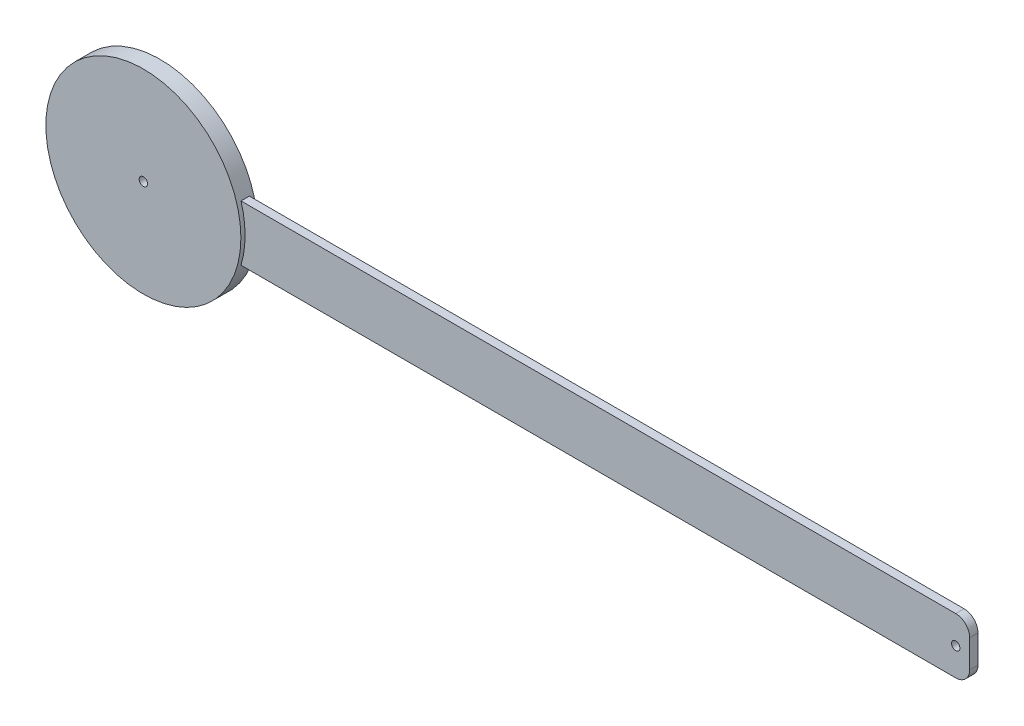
ISO-10303-21;
HEADER;
FILE_DESCRIPTION(('STEP AP214'),'2;1');
FILE_NAME('part.step','',(''),(''),'','','');
FILE_SCHEMA(('AUTOMOTIVE_DESIGN { 1 0 10303 214 1 1 1 1 }'));
ENDSEC;
DATA;
#1=APPLICATION_CONTEXT('core data for automotive mechanical design processes');
#2=APPLICATION_PROTOCOL_DEFINITION('international standard','automotive_design',2000,#1);
#3=PRODUCT_CONTEXT('',#1,'mechanical');
#4=PRODUCT('Part','Part','',(#3));
#5=PRODUCT_RELATED_PRODUCT_CATEGORY('part','',(#4));
#6=PRODUCT_DEFINITION_FORMATION('','',#4);
#7=PRODUCT_DEFINITION_CONTEXT('part definition',#1,'design');
#8=PRODUCT_DEFINITION('design','',#6,#7);
#9=PRODUCT_DEFINITION_SHAPE('','',#8);
#10=(LENGTH_UNIT() NAMED_UNIT(*) SI_UNIT(.MILLI.,.METRE.));
#11=(NAMED_UNIT(*) PLANE_ANGLE_UNIT() SI_UNIT($,.RADIAN.));
#12=(NAMED_UNIT(*) SI_UNIT($,.STERADIAN.) SOLID_ANGLE_UNIT());
#13=UNCERTAINTY_MEASURE_WITH_UNIT(LENGTH_MEASURE(1.E-05),#10,'distance_accuracy_value','');
#14=(GEOMETRIC_REPRESENTATION_CONTEXT(3) GLOBAL_UNCERTAINTY_ASSIGNED_CONTEXT((#13)) GLOBAL_UNIT_ASSIGNED_CONTEXT((#10,
#11,#12)) REPRESENTATION_CONTEXT('',''));
#15=CARTESIAN_POINT('',(0.,0.,0.));
#16=DIRECTION('',(0.,0.,1.));
#17=DIRECTION('',(1.,0.,0.));
#18=AXIS2_PLACEMENT_3D('',#15,#16,#17);
#19=CARTESIAN_POINT('',(145.,5.,3.));
#20=DIRECTION('',(0.,0.,-1.));
#21=DIRECTION('',(-1.,0.,0.));
#22=AXIS2_PLACEMENT_3D('',#19,#20,#21);
#23=PLANE('',#22);
#24=DIRECTION('',(-1.,0.,0.));
#25=VECTOR('',#24,1.);
#26=CARTESIAN_POINT('',(-145.,10.,3.));
#27=LINE('',#26,#25);
#28=CARTESIAN_POINT('',(145.,10.,3.));
#29=VERTEX_POINT('',#28);
#30=CARTESIAN_POINT('',(-111.458980337503,10.,3.));
#31=VERTEX_POINT('',#30);
#32=EDGE_CURVE('E85',#29,#31,#27,.T.);
#33=ORIENTED_EDGE('',*,*,#32,.T.);
#34=CARTESIAN_POINT('',(-145.,0.,3.));
#35=DIRECTION('',(0.,0.,-1.));
#36=DIRECTION('',(-1.,0.,0.));
#37=AXIS2_PLACEMENT_3D('',#34,#35,#36);
#38=CIRCLE('',#37,35.);
#39=CARTESIAN_POINT('',(-111.458980337503,-10.,3.));
#40=VERTEX_POINT('',#39);
#41=EDGE_CURVE('E95',#31,#40,#38,.T.);
#42=ORIENTED_EDGE('',*,*,#41,.T.);
#43=DIRECTION('',(1.,0.,0.));
#44=VECTOR('',#43,1.);
#45=CARTESIAN_POINT('',(-145.,-10.,3.));
#46=LINE('',#45,#44);
#47=CARTESIAN_POINT('',(145.,-10.,3.));
#48=VERTEX_POINT('',#47);
#49=EDGE_CURVE('E100',#40,#48,#46,.T.);
#50=ORIENTED_EDGE('',*,*,#49,.T.);
#51=CARTESIAN_POINT('',(145.,-5.,3.));
#52=DIRECTION('',(0.,0.,1.));
#53=DIRECTION('',(1.,0.,0.));
#54=AXIS2_PLACEMENT_3D('',#51,#52,#53);
#55=CIRCLE('',#54,5.);
#56=CARTESIAN_POINT('',(150.,-5.,3.));
#57=VERTEX_POINT('',#56);
#58=EDGE_CURVE('E108',#48,#57,#55,.T.);
#59=ORIENTED_EDGE('',*,*,#58,.T.);
#60=DIRECTION('',(0.,1.,0.));
#61=VECTOR('',#60,1.);
#62=CARTESIAN_POINT('',(150.,4.99999999999996,3.));
#63=LINE('',#62,#61);
#64=CARTESIAN_POINT('',(150.,4.99999999999996,3.));
#65=VERTEX_POINT('',#64);
#66=EDGE_CURVE('E56',#57,#65,#63,.T.);
#67=ORIENTED_EDGE('',*,*,#66,.T.);
#68=CARTESIAN_POINT('',(145.,5.,3.));
#69=DIRECTION('',(0.,0.,1.));
#70=DIRECTION('',(-1.,0.,0.));
#71=AXIS2_PLACEMENT_3D('',#68,#69,#70);
#72=CIRCLE('',#71,5.);
#73=EDGE_CURVE('E111',#65,#29,#72,.T.);
#74=ORIENTED_EDGE('',*,*,#73,.T.);
#75=EDGE_LOOP('',(#33,#42,#50,#59,#67,#74));
#76=FACE_BOUND('',#75,.T.);
#77=CARTESIAN_POINT('',(145.,0.,3.));
#78=DIRECTION('',(0.,0.,1.));
#79=DIRECTION('',(1.,0.,0.));
#80=AXIS2_PLACEMENT_3D('',#77,#78,#79);
#81=CIRCLE('',#80,1.5);
#82=CARTESIAN_POINT('',(146.5,0.,3.));
#83=VERTEX_POINT('',#82);
#84=EDGE_CURVE('E121',#83,#83,#81,.T.);
#85=ORIENTED_EDGE('',*,*,#84,.F.);
#86=EDGE_LOOP('',(#85));
#87=FACE_BOUND('',#86,.T.);
#88=ADVANCED_FACE('F33',(#76,#87),#23,.F.);
#89=CARTESIAN_POINT('',(145.,5.,0.));
#90=DIRECTION('',(0.,0.,-1.));
#91=DIRECTION('',(-1.,0.,0.));
#92=AXIS2_PLACEMENT_3D('',#89,#90,#91);
#93=PLANE('',#92);
#94=CARTESIAN_POINT('',(-145.,0.,0.));
#95=DIRECTION('',(0.,0.,-1.));
#96=DIRECTION('',(-1.,0.,0.));
#97=AXIS2_PLACEMENT_3D('',#94,#95,#96);
#98=CIRCLE('',#97,35.);
#99=CARTESIAN_POINT('',(-111.458980337503,10.,0.));
#100=VERTEX_POINT('',#99);
#101=CARTESIAN_POINT('',(-111.458980337503,-10.,0.));
#102=VERTEX_POINT('',#101);
#103=EDGE_CURVE('E48',#100,#102,#98,.T.);
#104=ORIENTED_EDGE('',*,*,#103,.F.);
#105=DIRECTION('',(-1.,0.,0.));
#106=VECTOR('',#105,1.);
#107=CARTESIAN_POINT('',(-145.,10.,0.));
#108=LINE('',#107,#106);
#109=CARTESIAN_POINT('',(145.,10.,0.));
#110=VERTEX_POINT('',#109);
#111=EDGE_CURVE('E120',#110,#100,#108,.T.);
#112=ORIENTED_EDGE('',*,*,#111,.F.);
#113=CARTESIAN_POINT('',(145.,5.,0.));
#114=DIRECTION('',(0.,0.,1.));
#115=DIRECTION('',(-1.,0.,0.));
#116=AXIS2_PLACEMENT_3D('',#113,#114,#115);
#117=CIRCLE('',#116,5.);
#118=CARTESIAN_POINT('',(150.,4.99999999999996,0.));
#119=VERTEX_POINT('',#118);
#120=EDGE_CURVE('E117',#119,#110,#117,.T.);
#121=ORIENTED_EDGE('',*,*,#120,.F.);
#122=DIRECTION('',(0.,1.,0.));
#123=VECTOR('',#122,1.);
#124=CARTESIAN_POINT('',(150.,4.99999999999996,0.));
#125=LINE('',#124,#123);
#126=CARTESIAN_POINT('',(150.,-5.,0.));
#127=VERTEX_POINT('',#126);
#128=EDGE_CURVE('E77',#127,#119,#125,.T.);
#129=ORIENTED_EDGE('',*,*,#128,.F.);
#130=CARTESIAN_POINT('',(145.,-5.,0.));
#131=DIRECTION('',(0.,0.,1.));
#132=DIRECTION('',(1.,0.,0.));
#133=AXIS2_PLACEMENT_3D('',#130,#131,#132);
#134=CIRCLE('',#133,5.);
#135=CARTESIAN_POINT('',(145.,-10.,0.));
#136=VERTEX_POINT('',#135);
#137=EDGE_CURVE('E126',#136,#127,#134,.T.);
#138=ORIENTED_EDGE('',*,*,#137,.F.);
#139=DIRECTION('',(1.,0.,0.));
#140=VECTOR('',#139,1.);
#141=CARTESIAN_POINT('',(-145.,-10.,0.));
#142=LINE('',#141,#140);
#143=EDGE_CURVE('E124',#102,#136,#142,.T.);
#144=ORIENTED_EDGE('',*,*,#143,.F.);
#145=EDGE_LOOP('',(#104,#112,#121,#129,#138,#144));
#146=FACE_BOUND('',#145,.T.);
#147=CARTESIAN_POINT('',(145.,0.,0.));
#148=DIRECTION('',(0.,0.,1.));
#149=DIRECTION('',(1.,0.,0.));
#150=AXIS2_PLACEMENT_3D('',#147,#148,#149);
#151=CIRCLE('',#150,1.5);
#152=CARTESIAN_POINT('',(146.5,0.,0.));
#153=VERTEX_POINT('',#152);
#154=EDGE_CURVE('E149',#153,#153,#151,.T.);
#155=ORIENTED_EDGE('',*,*,#154,.T.);
#156=EDGE_LOOP('',(#155));
#157=FACE_BOUND('',#156,.T.);
#158=ADVANCED_FACE('F138',(#146,#157),#93,.T.);
#159=CARTESIAN_POINT('',(145.,5.,3.));
#160=DIRECTION('',(0.,0.,-1.));
#161=DIRECTION('',(-1.,0.,0.));
#162=AXIS2_PLACEMENT_3D('',#159,#160,#161);
#163=CYLINDRICAL_SURFACE('',#162,5.);
#164=ORIENTED_EDGE('',*,*,#120,.T.);
#165=DIRECTION('',(0.,0.,-1.));
#166=VECTOR('',#165,1.);
#167=CARTESIAN_POINT('',(145.,10.,3.));
#168=LINE('',#167,#166);
#169=EDGE_CURVE('E41',#29,#110,#168,.T.);
#170=ORIENTED_EDGE('',*,*,#169,.F.);
#171=ORIENTED_EDGE('',*,*,#73,.F.);
#172=DIRECTION('',(0.,0.,-1.));
#173=VECTOR('',#172,1.);
#174=CARTESIAN_POINT('',(150.,4.99999999999996,3.));
#175=LINE('',#174,#173);
#176=EDGE_CURVE('E116',#65,#119,#175,.T.);
#177=ORIENTED_EDGE('',*,*,#176,.T.);
#178=EDGE_LOOP('',(#164,#170,#171,#177));
#179=FACE_BOUND('',#178,.T.);
#180=ADVANCED_FACE('F35',(#179),#163,.T.);
#181=CARTESIAN_POINT('',(-145.,10.,3.));
#182=DIRECTION('',(0.,-1.,0.));
#183=DIRECTION('',(1.,0.,0.));
#184=AXIS2_PLACEMENT_3D('',#181,#182,#183);
#185=PLANE('',#184);
#186=ORIENTED_EDGE('',*,*,#111,.T.);
#187=DIRECTION('',(0.,0.,1.));
#188=VECTOR('',#187,1.);
#189=CARTESIAN_POINT('',(-111.458980337503,10.,-1.5));
#190=LINE('',#189,#188);
#191=EDGE_CURVE('E102',#100,#31,#190,.T.);
#192=ORIENTED_EDGE('',*,*,#191,.T.);
#193=ORIENTED_EDGE('',*,*,#32,.F.);
#194=ORIENTED_EDGE('',*,*,#169,.T.);
#195=EDGE_LOOP('',(#186,#192,#193,#194));
#196=FACE_BOUND('',#195,.T.);
#197=ADVANCED_FACE('F133',(#196),#185,.F.);
#198=CARTESIAN_POINT('',(-145.,-10.,3.));
#199=DIRECTION('',(0.,1.,0.));
#200=DIRECTION('',(0.,0.,1.));
#201=AXIS2_PLACEMENT_3D('',#198,#199,#200);
#202=PLANE('',#201);
#203=ORIENTED_EDGE('',*,*,#49,.F.);
#204=DIRECTION('',(0.,0.,1.));
#205=VECTOR('',#204,1.);
#206=CARTESIAN_POINT('',(-111.458980337503,-10.,-1.5));
#207=LINE('',#206,#205);
#208=EDGE_CURVE('E11',#40,#102,#207,.F.);
#209=ORIENTED_EDGE('',*,*,#208,.T.);
#210=ORIENTED_EDGE('',*,*,#143,.T.);
#211=DIRECTION('',(0.,0.,-1.));
#212=VECTOR('',#211,1.);
#213=CARTESIAN_POINT('',(145.,-10.,3.));
#214=LINE('',#213,#212);
#215=EDGE_CURVE('E106',#48,#136,#214,.T.);
#216=ORIENTED_EDGE('',*,*,#215,.F.);
#217=EDGE_LOOP('',(#203,#209,#210,#216));
#218=FACE_BOUND('',#217,.T.);
#219=ADVANCED_FACE('F104',(#218),#202,.F.);
#220=CARTESIAN_POINT('',(145.,-5.,3.));
#221=DIRECTION('',(0.,0.,-1.));
#222=DIRECTION('',(-1.,0.,0.));
#223=AXIS2_PLACEMENT_3D('',#220,#221,#222);
#224=CYLINDRICAL_SURFACE('',#223,5.);
#225=ORIENTED_EDGE('',*,*,#137,.T.);
#226=DIRECTION('',(0.,0.,-1.));
#227=VECTOR('',#226,1.);
#228=CARTESIAN_POINT('',(150.,-5.,3.));
#229=LINE('',#228,#227);
#230=EDGE_CURVE('E130',#57,#127,#229,.T.);
#231=ORIENTED_EDGE('',*,*,#230,.F.);
#232=ORIENTED_EDGE('',*,*,#58,.F.);
#233=ORIENTED_EDGE('',*,*,#215,.T.);
#234=EDGE_LOOP('',(#225,#231,#232,#233));
#235=FACE_BOUND('',#234,.T.);
#236=ADVANCED_FACE('F167',(#235),#224,.T.);
#237=CARTESIAN_POINT('',(150.,4.99999999999996,3.));
#238=DIRECTION('',(-1.,0.,0.));
#239=DIRECTION('',(0.,0.,1.));
#240=AXIS2_PLACEMENT_3D('',#237,#238,#239);
#241=PLANE('',#240);
#242=ORIENTED_EDGE('',*,*,#128,.T.);
#243=ORIENTED_EDGE('',*,*,#176,.F.);
#244=ORIENTED_EDGE('',*,*,#66,.F.);
#245=ORIENTED_EDGE('',*,*,#230,.T.);
#246=EDGE_LOOP('',(#242,#243,#244,#245));
#247=FACE_BOUND('',#246,.T.);
#248=ADVANCED_FACE('F157',(#247),#241,.F.);
#249=CARTESIAN_POINT('',(145.,0.,3.));
#250=DIRECTION('',(0.,0.,-1.));
#251=DIRECTION('',(-1.,0.,0.));
#252=AXIS2_PLACEMENT_3D('',#249,#250,#251);
#253=CYLINDRICAL_SURFACE('',#252,1.5);
#254=ORIENTED_EDGE('',*,*,#84,.T.);
#255=EDGE_LOOP('',(#254));
#256=FACE_BOUND('',#255,.T.);
#257=ORIENTED_EDGE('',*,*,#154,.F.);
#258=EDGE_LOOP('',(#257));
#259=FACE_BOUND('',#258,.T.);
#260=ADVANCED_FACE('F155',(#256,#259),#253,.F.);
#261=CARTESIAN_POINT('',(-145.,0.,-1.5));
#262=DIRECTION('',(0.,0.,1.));
#263=DIRECTION('',(1.,0.,0.));
#264=AXIS2_PLACEMENT_3D('',#261,#262,#263);
#265=CYLINDRICAL_SURFACE('',#264,35.);
#266=CARTESIAN_POINT('',(-145.,0.,4.5));
#267=DIRECTION('',(0.,0.,1.));
#268=DIRECTION('',(1.,0.,0.));
#269=AXIS2_PLACEMENT_3D('',#266,#267,#268);
#270=CIRCLE('',#269,35.);
#271=CARTESIAN_POINT('',(-110.,0.,4.5));
#272=VERTEX_POINT('',#271);
#273=EDGE_CURVE('E144',#272,#272,#270,.T.);
#274=ORIENTED_EDGE('',*,*,#273,.F.);
#275=EDGE_LOOP('',(#274));
#276=FACE_BOUND('',#275,.T.);
#277=CARTESIAN_POINT('',(-145.,0.,-1.5));
#278=DIRECTION('',(0.,0.,1.));
#279=DIRECTION('',(1.,0.,0.));
#280=AXIS2_PLACEMENT_3D('',#277,#278,#279);
#281=CIRCLE('',#280,35.);
#282=CARTESIAN_POINT('',(-110.,0.,-1.5));
#283=VERTEX_POINT('',#282);
#284=EDGE_CURVE('E141',#283,#283,#281,.T.);
#285=ORIENTED_EDGE('',*,*,#284,.T.);
#286=EDGE_LOOP('',(#285));
#287=FACE_BOUND('',#286,.T.);
#288=ORIENTED_EDGE('',*,*,#191,.F.);
#289=ORIENTED_EDGE('',*,*,#103,.T.);
#290=ORIENTED_EDGE('',*,*,#208,.F.);
#291=ORIENTED_EDGE('',*,*,#41,.F.);
#292=EDGE_LOOP('',(#288,#289,#290,#291));
#293=FACE_BOUND('',#292,.T.);
#294=ADVANCED_FACE('F94',(#276,#287,#293),#265,.T.);
#295=CARTESIAN_POINT('',(-145.,0.,-1.5));
#296=DIRECTION('',(0.,0.,1.));
#297=DIRECTION('',(1.,0.,0.));
#298=AXIS2_PLACEMENT_3D('',#295,#296,#297);
#299=PLANE('',#298);
#300=CARTESIAN_POINT('',(-145.,0.,-1.5));
#301=DIRECTION('',(0.,0.,1.));
#302=DIRECTION('',(1.,0.,0.));
#303=AXIS2_PLACEMENT_3D('',#300,#301,#302);
#304=CIRCLE('',#303,1.5);
#305=CARTESIAN_POINT('',(-143.5,0.,-1.5));
#306=VERTEX_POINT('',#305);
#307=EDGE_CURVE('E247',#306,#306,#304,.T.);
#308=ORIENTED_EDGE('',*,*,#307,.T.);
#309=EDGE_LOOP('',(#308));
#310=FACE_BOUND('',#309,.T.);
#311=ORIENTED_EDGE('',*,*,#284,.F.);
#312=EDGE_LOOP('',(#311));
#313=FACE_BOUND('',#312,.T.);
#314=ADVANCED_FACE('F164',(#310,#313),#299,.F.);
#315=CARTESIAN_POINT('',(-145.,0.,4.5));
#316=DIRECTION('',(0.,0.,1.));
#317=DIRECTION('',(1.,0.,0.));
#318=AXIS2_PLACEMENT_3D('',#315,#316,#317);
#319=PLANE('',#318);
#320=CARTESIAN_POINT('',(-145.,0.,4.5));
#321=DIRECTION('',(0.,0.,1.));
#322=DIRECTION('',(1.,0.,0.));
#323=AXIS2_PLACEMENT_3D('',#320,#321,#322);
#324=CIRCLE('',#323,1.5);
#325=CARTESIAN_POINT('',(-143.5,0.,4.5));
#326=VERTEX_POINT('',#325);
#327=EDGE_CURVE('E250',#326,#326,#324,.T.);
#328=ORIENTED_EDGE('',*,*,#327,.F.);
#329=EDGE_LOOP('',(#328));
#330=FACE_BOUND('',#329,.T.);
#331=ORIENTED_EDGE('',*,*,#273,.T.);
#332=EDGE_LOOP('',(#331));
#333=FACE_BOUND('',#332,.T.);
#334=ADVANCED_FACE('F220',(#330,#333),#319,.T.);
#335=CARTESIAN_POINT('',(-145.,0.,-1.5));
#336=DIRECTION('',(0.,0.,1.));
#337=DIRECTION('',(1.,0.,0.));
#338=AXIS2_PLACEMENT_3D('',#335,#336,#337);
#339=CYLINDRICAL_SURFACE('',#338,1.5);
#340=ORIENTED_EDGE('',*,*,#307,.F.);
#341=EDGE_LOOP('',(#340));
#342=FACE_BOUND('',#341,.T.);
#343=ORIENTED_EDGE('',*,*,#327,.T.);
#344=EDGE_LOOP('',(#343));
#345=FACE_BOUND('',#344,.T.);
#346=ADVANCED_FACE('F230',(#342,#345),#339,.F.);
#347=CLOSED_SHELL('',(#88,#158,#180,#197,#219,#236,#248,#260,#294,#314,#334,#346));
#348=MANIFOLD_SOLID_BREP('B2',#347);
#349=ADVANCED_BREP_SHAPE_REPRESENTATION('',(#18,#348),#14);
#350=SHAPE_DEFINITION_REPRESENTATION(#9,#349);
ENDSEC;
END-ISO-10303-21;
